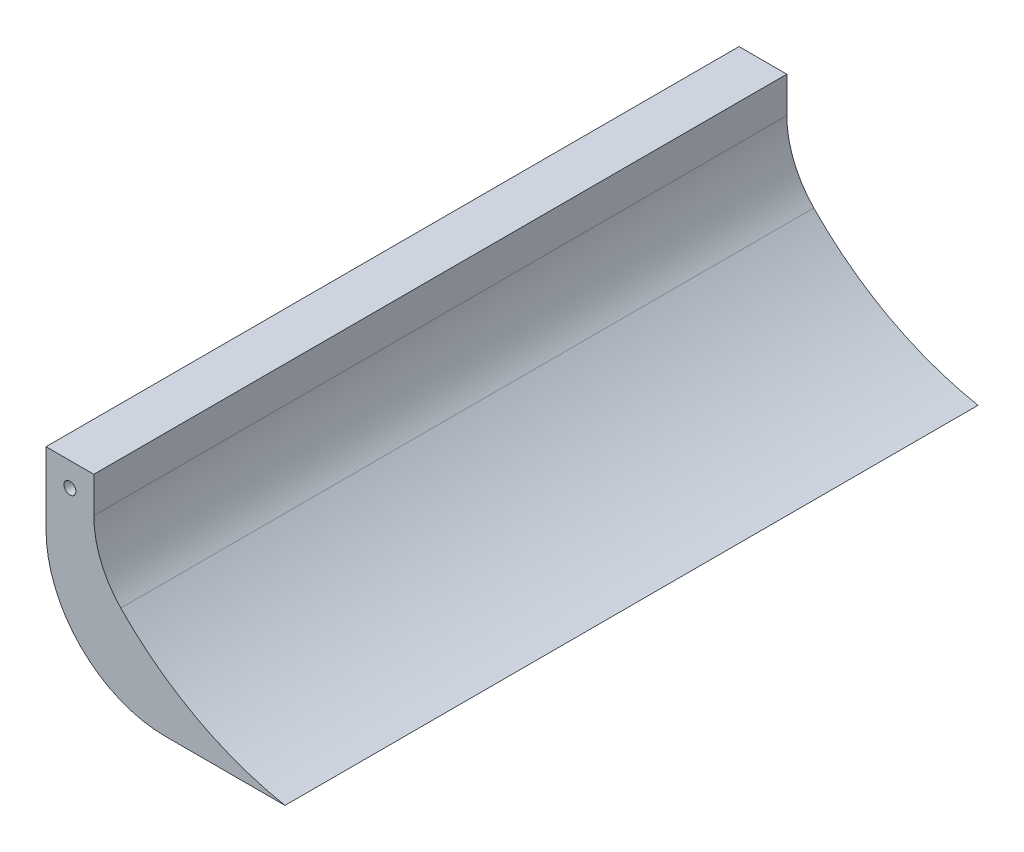
ISO-10303-21;
HEADER;
FILE_DESCRIPTION(('STEP AP214'),'2;1');
FILE_NAME('part.step','',(''),(''),'','','');
FILE_SCHEMA(('AUTOMOTIVE_DESIGN { 1 0 10303 214 1 1 1 1 }'));
ENDSEC;
DATA;
#1=APPLICATION_CONTEXT('core data for automotive mechanical design processes');
#2=APPLICATION_PROTOCOL_DEFINITION('international standard','automotive_design',2000,#1);
#3=PRODUCT_CONTEXT('',#1,'mechanical');
#4=PRODUCT('Part','Part','',(#3));
#5=PRODUCT_RELATED_PRODUCT_CATEGORY('part','',(#4));
#6=PRODUCT_DEFINITION_FORMATION('','',#4);
#7=PRODUCT_DEFINITION_CONTEXT('part definition',#1,'design');
#8=PRODUCT_DEFINITION('design','',#6,#7);
#9=PRODUCT_DEFINITION_SHAPE('','',#8);
#10=(LENGTH_UNIT() NAMED_UNIT(*) SI_UNIT(.MILLI.,.METRE.));
#11=(NAMED_UNIT(*) PLANE_ANGLE_UNIT() SI_UNIT($,.RADIAN.));
#12=(NAMED_UNIT(*) SI_UNIT($,.STERADIAN.) SOLID_ANGLE_UNIT());
#13=UNCERTAINTY_MEASURE_WITH_UNIT(LENGTH_MEASURE(1.E-05),#10,'distance_accuracy_value','');
#14=(GEOMETRIC_REPRESENTATION_CONTEXT(3) GLOBAL_UNCERTAINTY_ASSIGNED_CONTEXT((#13)) GLOBAL_UNIT_ASSIGNED_CONTEXT((#10,
#11,#12)) REPRESENTATION_CONTEXT('',''));
#15=CARTESIAN_POINT('',(0.,0.,0.));
#16=DIRECTION('',(0.,0.,1.));
#17=DIRECTION('',(1.,0.,0.));
#18=AXIS2_PLACEMENT_3D('',#15,#16,#17);
#19=CARTESIAN_POINT('',(158.26208664845,162.113207168277,368.3));
#20=DIRECTION('',(0.,0.,1.));
#21=DIRECTION('',(1.,0.,0.));
#22=AXIS2_PLACEMENT_3D('',#19,#20,#21);
#23=PLANE('',#22);
#24=CARTESIAN_POINT('',(158.26208664845,162.113207168277,368.3));
#25=DIRECTION('',(0.,0.,-1.));
#26=DIRECTION('',(1.,0.,0.));
#27=AXIS2_PLACEMENT_3D('',#24,#25,#26);
#28=CIRCLE('',#27,165.1);
#29=CARTESIAN_POINT('',(127.,0.,368.3));
#30=VERTEX_POINT('',#29);
#31=CARTESIAN_POINT('',(39.7279614895775,47.1885745918768,368.3));
#32=VERTEX_POINT('',#31);
#33=EDGE_CURVE('E141',#30,#32,#28,.T.);
#34=ORIENTED_EDGE('',*,*,#33,.T.);
#35=CARTESIAN_POINT('',(76.2,82.55,368.3));
#36=DIRECTION('',(0.,0.,-1.));
#37=DIRECTION('',(1.,0.,0.));
#38=AXIS2_PLACEMENT_3D('',#35,#36,#37);
#39=CIRCLE('',#38,50.8000000000001);
#40=CARTESIAN_POINT('',(25.4,82.55,368.3));
#41=VERTEX_POINT('',#40);
#42=EDGE_CURVE('E94',#32,#41,#39,.T.);
#43=ORIENTED_EDGE('',*,*,#42,.T.);
#44=DIRECTION('',(0.,1.,0.));
#45=VECTOR('',#44,1.);
#46=CARTESIAN_POINT('',(25.4,101.6,368.3));
#47=LINE('',#46,#45);
#48=CARTESIAN_POINT('',(25.4,101.6,368.3));
#49=VERTEX_POINT('',#48);
#50=EDGE_CURVE('E153',#41,#49,#47,.T.);
#51=ORIENTED_EDGE('',*,*,#50,.T.);
#52=DIRECTION('',(-1.,0.,0.));
#53=VECTOR('',#52,1.);
#54=CARTESIAN_POINT('',(0.,101.6,368.3));
#55=LINE('',#54,#53);
#56=CARTESIAN_POINT('',(0.,101.6,368.3));
#57=VERTEX_POINT('',#56);
#58=EDGE_CURVE('E110',#49,#57,#55,.T.);
#59=ORIENTED_EDGE('',*,*,#58,.T.);
#60=DIRECTION('',(0.,-1.,0.));
#61=VECTOR('',#60,1.);
#62=CARTESIAN_POINT('',(0.,63.5000000000005,368.3));
#63=LINE('',#62,#61);
#64=CARTESIAN_POINT('',(0.,63.5,368.3));
#65=VERTEX_POINT('',#64);
#66=EDGE_CURVE('E104',#57,#65,#63,.T.);
#67=ORIENTED_EDGE('',*,*,#66,.T.);
#68=CARTESIAN_POINT('',(63.5,63.5,368.3));
#69=DIRECTION('',(0.,0.,1.));
#70=DIRECTION('',(-1.,0.,0.));
#71=AXIS2_PLACEMENT_3D('',#68,#69,#70);
#72=CIRCLE('',#71,63.5);
#73=CARTESIAN_POINT('',(63.5000000000005,0.,368.3));
#74=VERTEX_POINT('',#73);
#75=EDGE_CURVE('E108',#65,#74,#72,.T.);
#76=ORIENTED_EDGE('',*,*,#75,.T.);
#77=DIRECTION('',(1.,0.,0.));
#78=VECTOR('',#77,1.);
#79=CARTESIAN_POINT('',(63.5000000000005,0.,368.3));
#80=LINE('',#79,#78);
#81=EDGE_CURVE('E54',#74,#30,#80,.T.);
#82=ORIENTED_EDGE('',*,*,#81,.T.);
#83=EDGE_LOOP('',(#34,#43,#51,#59,#67,#76,#82));
#84=FACE_BOUND('',#83,.T.);
#85=CARTESIAN_POINT('',(12.7,88.9,368.3));
#86=DIRECTION('',(0.,0.,1.));
#87=DIRECTION('',(1.,0.,0.));
#88=AXIS2_PLACEMENT_3D('',#85,#86,#87);
#89=CIRCLE('',#88,3.175);
#90=CARTESIAN_POINT('',(15.875,88.9,368.3));
#91=VERTEX_POINT('',#90);
#92=EDGE_CURVE('E132',#91,#91,#89,.T.);
#93=ORIENTED_EDGE('',*,*,#92,.F.);
#94=EDGE_LOOP('',(#93));
#95=FACE_BOUND('',#94,.T.);
#96=ADVANCED_FACE('F37',(#84,#95),#23,.T.);
#97=CARTESIAN_POINT('',(158.26208664845,162.113207168277,0.));
#98=DIRECTION('',(0.,0.,1.));
#99=DIRECTION('',(1.,0.,0.));
#100=AXIS2_PLACEMENT_3D('',#97,#98,#99);
#101=PLANE('',#100);
#102=CARTESIAN_POINT('',(158.26208664845,162.113207168277,0.));
#103=DIRECTION('',(0.,0.,-1.));
#104=DIRECTION('',(1.,0.,0.));
#105=AXIS2_PLACEMENT_3D('',#102,#103,#104);
#106=CIRCLE('',#105,165.1);
#107=CARTESIAN_POINT('',(127.,0.,0.));
#108=VERTEX_POINT('',#107);
#109=CARTESIAN_POINT('',(39.7279614895775,47.1885745918768,0.));
#110=VERTEX_POINT('',#109);
#111=EDGE_CURVE('E128',#108,#110,#106,.T.);
#112=ORIENTED_EDGE('',*,*,#111,.F.);
#113=DIRECTION('',(1.,0.,0.));
#114=VECTOR('',#113,1.);
#115=CARTESIAN_POINT('',(63.5000000000005,0.,0.));
#116=LINE('',#115,#114);
#117=CARTESIAN_POINT('',(63.5000000000005,0.,0.));
#118=VERTEX_POINT('',#117);
#119=EDGE_CURVE('E86',#118,#108,#116,.T.);
#120=ORIENTED_EDGE('',*,*,#119,.F.);
#121=CARTESIAN_POINT('',(63.5,63.5,0.));
#122=DIRECTION('',(0.,0.,1.));
#123=DIRECTION('',(-1.,0.,0.));
#124=AXIS2_PLACEMENT_3D('',#121,#122,#123);
#125=CIRCLE('',#124,63.5);
#126=CARTESIAN_POINT('',(0.,63.5,0.));
#127=VERTEX_POINT('',#126);
#128=EDGE_CURVE('E80',#127,#118,#125,.T.);
#129=ORIENTED_EDGE('',*,*,#128,.F.);
#130=DIRECTION('',(0.,-1.,0.));
#131=VECTOR('',#130,1.);
#132=CARTESIAN_POINT('',(0.,63.5000000000005,0.));
#133=LINE('',#132,#131);
#134=CARTESIAN_POINT('',(0.,101.6,0.));
#135=VERTEX_POINT('',#134);
#136=EDGE_CURVE('E118',#135,#127,#133,.T.);
#137=ORIENTED_EDGE('',*,*,#136,.F.);
#138=DIRECTION('',(-1.,0.,0.));
#139=VECTOR('',#138,1.);
#140=CARTESIAN_POINT('',(0.,101.6,0.));
#141=LINE('',#140,#139);
#142=CARTESIAN_POINT('',(25.4,101.6,0.));
#143=VERTEX_POINT('',#142);
#144=EDGE_CURVE('E136',#143,#135,#141,.T.);
#145=ORIENTED_EDGE('',*,*,#144,.F.);
#146=DIRECTION('',(0.,1.,0.));
#147=VECTOR('',#146,1.);
#148=CARTESIAN_POINT('',(25.4,101.6,0.));
#149=LINE('',#148,#147);
#150=CARTESIAN_POINT('',(25.4,82.55,0.));
#151=VERTEX_POINT('',#150);
#152=EDGE_CURVE('E134',#151,#143,#149,.T.);
#153=ORIENTED_EDGE('',*,*,#152,.F.);
#154=CARTESIAN_POINT('',(76.2,82.55,0.));
#155=DIRECTION('',(0.,0.,-1.));
#156=DIRECTION('',(1.,0.,0.));
#157=AXIS2_PLACEMENT_3D('',#154,#155,#156);
#158=CIRCLE('',#157,50.8000000000001);
#159=EDGE_CURVE('E131',#110,#151,#158,.T.);
#160=ORIENTED_EDGE('',*,*,#159,.F.);
#161=EDGE_LOOP('',(#112,#120,#129,#137,#145,#153,#160));
#162=FACE_BOUND('',#161,.T.);
#163=CARTESIAN_POINT('',(12.7,88.9,0.));
#164=DIRECTION('',(0.,0.,1.));
#165=DIRECTION('',(1.,0.,0.));
#166=AXIS2_PLACEMENT_3D('',#163,#164,#165);
#167=CIRCLE('',#166,3.175);
#168=CARTESIAN_POINT('',(15.875,88.9,0.));
#169=VERTEX_POINT('',#168);
#170=EDGE_CURVE('E165',#169,#169,#167,.T.);
#171=ORIENTED_EDGE('',*,*,#170,.T.);
#172=EDGE_LOOP('',(#171));
#173=FACE_BOUND('',#172,.T.);
#174=ADVANCED_FACE('F157',(#162,#173),#101,.F.);
#175=CARTESIAN_POINT('',(158.26208664845,162.113207168277,368.3));
#176=DIRECTION('',(0.,0.,-1.));
#177=DIRECTION('',(-1.,0.,0.));
#178=AXIS2_PLACEMENT_3D('',#175,#176,#177);
#179=CYLINDRICAL_SURFACE('',#178,165.1);
#180=ORIENTED_EDGE('',*,*,#111,.T.);
#181=DIRECTION('',(0.,0.,-1.));
#182=VECTOR('',#181,1.);
#183=CARTESIAN_POINT('',(39.7279614895775,47.1885745918768,368.3));
#184=LINE('',#183,#182);
#185=EDGE_CURVE('E11',#32,#110,#184,.T.);
#186=ORIENTED_EDGE('',*,*,#185,.F.);
#187=ORIENTED_EDGE('',*,*,#33,.F.);
#188=DIRECTION('',(0.,0.,-1.));
#189=VECTOR('',#188,1.);
#190=CARTESIAN_POINT('',(127.,0.,368.3));
#191=LINE('',#190,#189);
#192=EDGE_CURVE('E124',#30,#108,#191,.T.);
#193=ORIENTED_EDGE('',*,*,#192,.T.);
#194=EDGE_LOOP('',(#180,#186,#187,#193));
#195=FACE_BOUND('',#194,.T.);
#196=ADVANCED_FACE('F39',(#195),#179,.F.);
#197=CARTESIAN_POINT('',(76.2,82.55,368.3));
#198=DIRECTION('',(0.,0.,-1.));
#199=DIRECTION('',(-1.,0.,0.));
#200=AXIS2_PLACEMENT_3D('',#197,#198,#199);
#201=CYLINDRICAL_SURFACE('',#200,50.8000000000001);
#202=ORIENTED_EDGE('',*,*,#159,.T.);
#203=DIRECTION('',(0.,0.,-1.));
#204=VECTOR('',#203,1.);
#205=CARTESIAN_POINT('',(25.4,82.55,368.3));
#206=LINE('',#205,#204);
#207=EDGE_CURVE('E46',#41,#151,#206,.T.);
#208=ORIENTED_EDGE('',*,*,#207,.F.);
#209=ORIENTED_EDGE('',*,*,#42,.F.);
#210=ORIENTED_EDGE('',*,*,#185,.T.);
#211=EDGE_LOOP('',(#202,#208,#209,#210));
#212=FACE_BOUND('',#211,.T.);
#213=ADVANCED_FACE('F191',(#212),#201,.F.);
#214=CARTESIAN_POINT('',(25.4,101.6,368.3));
#215=DIRECTION('',(-1.,0.,0.));
#216=DIRECTION('',(0.,0.,1.));
#217=AXIS2_PLACEMENT_3D('',#214,#215,#216);
#218=PLANE('',#217);
#219=ORIENTED_EDGE('',*,*,#152,.T.);
#220=DIRECTION('',(0.,0.,-1.));
#221=VECTOR('',#220,1.);
#222=CARTESIAN_POINT('',(25.4,101.6,368.3));
#223=LINE('',#222,#221);
#224=EDGE_CURVE('E145',#49,#143,#223,.T.);
#225=ORIENTED_EDGE('',*,*,#224,.F.);
#226=ORIENTED_EDGE('',*,*,#50,.F.);
#227=ORIENTED_EDGE('',*,*,#207,.T.);
#228=EDGE_LOOP('',(#219,#225,#226,#227));
#229=FACE_BOUND('',#228,.T.);
#230=ADVANCED_FACE('F151',(#229),#218,.F.);
#231=CARTESIAN_POINT('',(0.,101.6,368.3));
#232=DIRECTION('',(0.,-1.,0.));
#233=DIRECTION('',(0.,0.,-1.));
#234=AXIS2_PLACEMENT_3D('',#231,#232,#233);
#235=PLANE('',#234);
#236=ORIENTED_EDGE('',*,*,#144,.T.);
#237=DIRECTION('',(0.,0.,-1.));
#238=VECTOR('',#237,1.);
#239=CARTESIAN_POINT('',(0.,101.6,368.3));
#240=LINE('',#239,#238);
#241=EDGE_CURVE('E119',#57,#135,#240,.T.);
#242=ORIENTED_EDGE('',*,*,#241,.F.);
#243=ORIENTED_EDGE('',*,*,#58,.F.);
#244=ORIENTED_EDGE('',*,*,#224,.T.);
#245=EDGE_LOOP('',(#236,#242,#243,#244));
#246=FACE_BOUND('',#245,.T.);
#247=ADVANCED_FACE('F160',(#246),#235,.F.);
#248=CARTESIAN_POINT('',(0.,63.5000000000005,368.3));
#249=DIRECTION('',(1.,0.,0.));
#250=DIRECTION('',(0.,0.,-1.));
#251=AXIS2_PLACEMENT_3D('',#248,#249,#250);
#252=PLANE('',#251);
#253=ORIENTED_EDGE('',*,*,#136,.T.);
#254=DIRECTION('',(0.,0.,-1.));
#255=VECTOR('',#254,1.);
#256=CARTESIAN_POINT('',(0.,63.5,368.3));
#257=LINE('',#256,#255);
#258=EDGE_CURVE('E115',#65,#127,#257,.T.);
#259=ORIENTED_EDGE('',*,*,#258,.F.);
#260=ORIENTED_EDGE('',*,*,#66,.F.);
#261=ORIENTED_EDGE('',*,*,#241,.T.);
#262=EDGE_LOOP('',(#253,#259,#260,#261));
#263=FACE_BOUND('',#262,.T.);
#264=ADVANCED_FACE('F116',(#263),#252,.F.);
#265=CARTESIAN_POINT('',(63.5,63.5,368.3));
#266=DIRECTION('',(0.,0.,-1.));
#267=DIRECTION('',(-1.,0.,0.));
#268=AXIS2_PLACEMENT_3D('',#265,#266,#267);
#269=CYLINDRICAL_SURFACE('',#268,63.5);
#270=ORIENTED_EDGE('',*,*,#128,.T.);
#271=DIRECTION('',(0.,0.,-1.));
#272=VECTOR('',#271,1.);
#273=CARTESIAN_POINT('',(63.5000000000005,0.,368.3));
#274=LINE('',#273,#272);
#275=EDGE_CURVE('E120',#74,#118,#274,.T.);
#276=ORIENTED_EDGE('',*,*,#275,.F.);
#277=ORIENTED_EDGE('',*,*,#75,.F.);
#278=ORIENTED_EDGE('',*,*,#258,.T.);
#279=EDGE_LOOP('',(#270,#276,#277,#278));
#280=FACE_BOUND('',#279,.T.);
#281=ADVANCED_FACE('F122',(#280),#269,.T.);
#282=CARTESIAN_POINT('',(63.5000000000005,0.,368.3));
#283=DIRECTION('',(0.,1.,0.));
#284=DIRECTION('',(0.,0.,1.));
#285=AXIS2_PLACEMENT_3D('',#282,#283,#284);
#286=PLANE('',#285);
#287=ORIENTED_EDGE('',*,*,#119,.T.);
#288=ORIENTED_EDGE('',*,*,#192,.F.);
#289=ORIENTED_EDGE('',*,*,#81,.F.);
#290=ORIENTED_EDGE('',*,*,#275,.T.);
#291=EDGE_LOOP('',(#287,#288,#289,#290));
#292=FACE_BOUND('',#291,.T.);
#293=ADVANCED_FACE('F181',(#292),#286,.F.);
#294=CARTESIAN_POINT('',(12.7,88.9,368.3));
#295=DIRECTION('',(0.,0.,-1.));
#296=DIRECTION('',(-1.,0.,0.));
#297=AXIS2_PLACEMENT_3D('',#294,#295,#296);
#298=CYLINDRICAL_SURFACE('',#297,3.175);
#299=ORIENTED_EDGE('',*,*,#92,.T.);
#300=EDGE_LOOP('',(#299));
#301=FACE_BOUND('',#300,.T.);
#302=ORIENTED_EDGE('',*,*,#170,.F.);
#303=EDGE_LOOP('',(#302));
#304=FACE_BOUND('',#303,.T.);
#305=ADVANCED_FACE('F171',(#301,#304),#298,.F.);
#306=CLOSED_SHELL('',(#96,#174,#196,#213,#230,#247,#264,#281,#293,#305));
#307=MANIFOLD_SOLID_BREP('B2',#306);
#308=ADVANCED_BREP_SHAPE_REPRESENTATION('',(#18,#307),#14);
#309=SHAPE_DEFINITION_REPRESENTATION(#9,#308);
ENDSEC;
END-ISO-10303-21;
